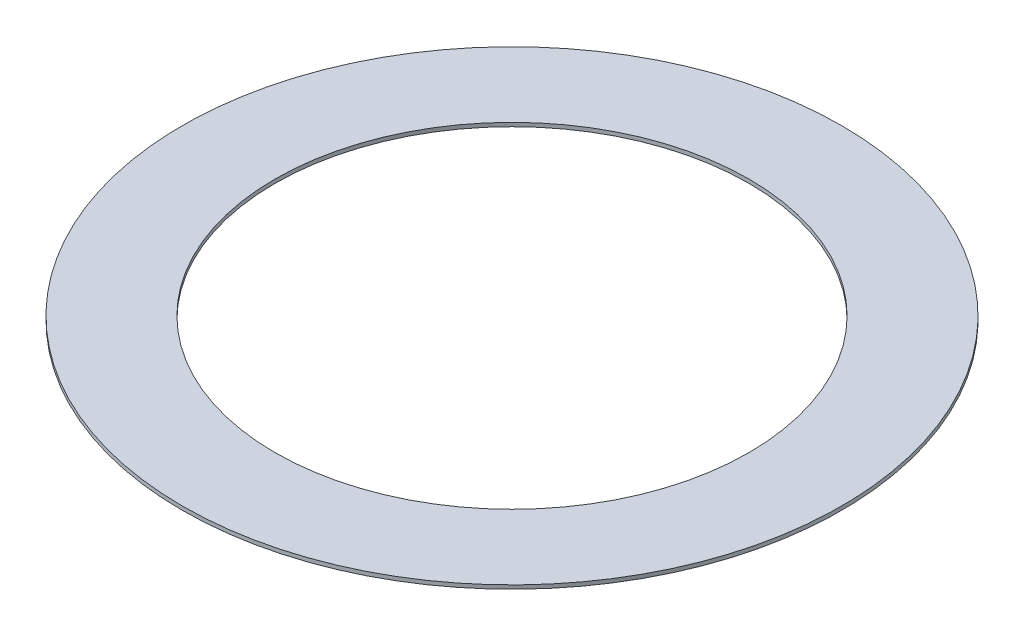
ISO-10303-21;
HEADER;
FILE_DESCRIPTION(('STEP AP214'),'2;1');
FILE_NAME('part.step','',(''),(''),'','','');
FILE_SCHEMA(('AUTOMOTIVE_DESIGN { 1 0 10303 214 1 1 1 1 }'));
ENDSEC;
DATA;
#1=APPLICATION_CONTEXT('core data for automotive mechanical design processes');
#2=APPLICATION_PROTOCOL_DEFINITION('international standard','automotive_design',2000,#1);
#3=PRODUCT_CONTEXT('',#1,'mechanical');
#4=PRODUCT('Part','Part','',(#3));
#5=PRODUCT_RELATED_PRODUCT_CATEGORY('part','',(#4));
#6=PRODUCT_DEFINITION_FORMATION('','',#4);
#7=PRODUCT_DEFINITION_CONTEXT('part definition',#1,'design');
#8=PRODUCT_DEFINITION('design','',#6,#7);
#9=PRODUCT_DEFINITION_SHAPE('','',#8);
#10=(LENGTH_UNIT() NAMED_UNIT(*) SI_UNIT(.MILLI.,.METRE.));
#11=(NAMED_UNIT(*) PLANE_ANGLE_UNIT() SI_UNIT($,.RADIAN.));
#12=(NAMED_UNIT(*) SI_UNIT($,.STERADIAN.) SOLID_ANGLE_UNIT());
#13=UNCERTAINTY_MEASURE_WITH_UNIT(LENGTH_MEASURE(1.E-05),#10,'distance_accuracy_value','');
#14=(GEOMETRIC_REPRESENTATION_CONTEXT(3) GLOBAL_UNCERTAINTY_ASSIGNED_CONTEXT((#13)) GLOBAL_UNIT_ASSIGNED_CONTEXT((#10,
#11,#12)) REPRESENTATION_CONTEXT('',''));
#15=CARTESIAN_POINT('',(0.,0.,0.));
#16=DIRECTION('',(0.,0.,1.));
#17=DIRECTION('',(1.,0.,0.));
#18=AXIS2_PLACEMENT_3D('',#15,#16,#17);
#19=CARTESIAN_POINT('',(0.,0.127,0.));
#20=DIRECTION('',(0.,1.,0.));
#21=DIRECTION('',(0.,0.,1.));
#22=AXIS2_PLACEMENT_3D('',#19,#20,#21);
#23=PLANE('',#22);
#24=CARTESIAN_POINT('',(0.,0.127,0.));
#25=DIRECTION('',(0.,1.,0.));
#26=DIRECTION('',(0.,0.,1.));
#27=AXIS2_PLACEMENT_3D('',#24,#25,#26);
#28=CIRCLE('',#27,11.0744);
#29=CARTESIAN_POINT('',(0.,0.127,11.0744));
#30=VERTEX_POINT('',#29);
#31=EDGE_CURVE('E10',#30,#30,#28,.T.);
#32=ORIENTED_EDGE('',*,*,#31,.T.);
#33=EDGE_LOOP('',(#32));
#34=FACE_BOUND('',#33,.T.);
#35=CARTESIAN_POINT('',(0.,0.127,0.));
#36=DIRECTION('',(0.,1.,0.));
#37=DIRECTION('',(0.,0.,1.));
#38=AXIS2_PLACEMENT_3D('',#35,#36,#37);
#39=CIRCLE('',#38,7.9629);
#40=CARTESIAN_POINT('',(0.,0.127,7.9629));
#41=VERTEX_POINT('',#40);
#42=EDGE_CURVE('E39',#41,#41,#39,.T.);
#43=ORIENTED_EDGE('',*,*,#42,.F.);
#44=EDGE_LOOP('',(#43));
#45=FACE_BOUND('',#44,.T.);
#46=ADVANCED_FACE('F28',(#34,#45),#23,.T.);
#47=CARTESIAN_POINT('',(0.,0.,0.));
#48=DIRECTION('',(0.,1.,0.));
#49=DIRECTION('',(0.,0.,1.));
#50=AXIS2_PLACEMENT_3D('',#47,#48,#49);
#51=PLANE('',#50);
#52=CARTESIAN_POINT('',(0.,0.,0.));
#53=DIRECTION('',(0.,1.,0.));
#54=DIRECTION('',(0.,0.,1.));
#55=AXIS2_PLACEMENT_3D('',#52,#53,#54);
#56=CIRCLE('',#55,11.0744);
#57=CARTESIAN_POINT('',(0.,0.,11.0744));
#58=VERTEX_POINT('',#57);
#59=EDGE_CURVE('E32',#58,#58,#56,.T.);
#60=ORIENTED_EDGE('',*,*,#59,.F.);
#61=EDGE_LOOP('',(#60));
#62=FACE_BOUND('',#61,.T.);
#63=CARTESIAN_POINT('',(0.,0.,0.));
#64=DIRECTION('',(0.,1.,0.));
#65=DIRECTION('',(0.,0.,1.));
#66=AXIS2_PLACEMENT_3D('',#63,#64,#65);
#67=CIRCLE('',#66,7.9629);
#68=CARTESIAN_POINT('',(0.,0.,7.9629));
#69=VERTEX_POINT('',#68);
#70=EDGE_CURVE('E41',#69,#69,#67,.T.);
#71=ORIENTED_EDGE('',*,*,#70,.T.);
#72=EDGE_LOOP('',(#71));
#73=FACE_BOUND('',#72,.T.);
#74=ADVANCED_FACE('F51',(#62,#73),#51,.F.);
#75=CARTESIAN_POINT('',(0.,0.127,0.));
#76=DIRECTION('',(0.,-1.,0.));
#77=DIRECTION('',(0.,0.,-1.));
#78=AXIS2_PLACEMENT_3D('',#75,#76,#77);
#79=CYLINDRICAL_SURFACE('',#78,11.0744);
#80=ORIENTED_EDGE('',*,*,#31,.F.);
#81=EDGE_LOOP('',(#80));
#82=FACE_BOUND('',#81,.T.);
#83=ORIENTED_EDGE('',*,*,#59,.T.);
#84=EDGE_LOOP('',(#83));
#85=FACE_BOUND('',#84,.T.);
#86=ADVANCED_FACE('F30',(#82,#85),#79,.T.);
#87=CARTESIAN_POINT('',(0.,0.127,0.));
#88=DIRECTION('',(0.,-1.,0.));
#89=DIRECTION('',(0.,0.,-1.));
#90=AXIS2_PLACEMENT_3D('',#87,#88,#89);
#91=CYLINDRICAL_SURFACE('',#90,7.9629);
#92=ORIENTED_EDGE('',*,*,#42,.T.);
#93=EDGE_LOOP('',(#92));
#94=FACE_BOUND('',#93,.T.);
#95=ORIENTED_EDGE('',*,*,#70,.F.);
#96=EDGE_LOOP('',(#95));
#97=FACE_BOUND('',#96,.T.);
#98=ADVANCED_FACE('F47',(#94,#97),#91,.F.);
#99=CLOSED_SHELL('',(#46,#74,#86,#98));
#100=MANIFOLD_SOLID_BREP('B2',#99);
#101=ADVANCED_BREP_SHAPE_REPRESENTATION('',(#18,#100),#14);
#102=SHAPE_DEFINITION_REPRESENTATION(#9,#101);
ENDSEC;
END-ISO-10303-21;
